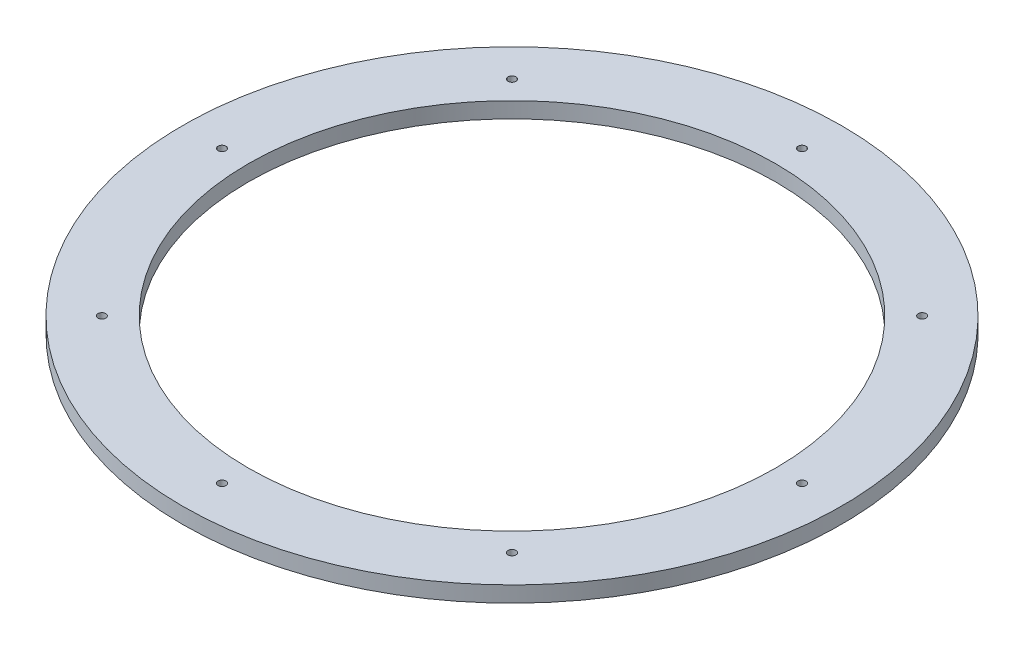
ISO-10303-21;
HEADER;
FILE_DESCRIPTION(('STEP AP214'),'2;1');
FILE_NAME('part.step','',(''),(''),'','','');
FILE_SCHEMA(('AUTOMOTIVE_DESIGN { 1 0 10303 214 1 1 1 1 }'));
ENDSEC;
DATA;
#1=APPLICATION_CONTEXT('core data for automotive mechanical design processes');
#2=APPLICATION_PROTOCOL_DEFINITION('international standard','automotive_design',2000,#1);
#3=PRODUCT_CONTEXT('',#1,'mechanical');
#4=PRODUCT('Part','Part','',(#3));
#5=PRODUCT_RELATED_PRODUCT_CATEGORY('part','',(#4));
#6=PRODUCT_DEFINITION_FORMATION('','',#4);
#7=PRODUCT_DEFINITION_CONTEXT('part definition',#1,'design');
#8=PRODUCT_DEFINITION('design','',#6,#7);
#9=PRODUCT_DEFINITION_SHAPE('','',#8);
#10=(LENGTH_UNIT() NAMED_UNIT(*) SI_UNIT(.MILLI.,.METRE.));
#11=(NAMED_UNIT(*) PLANE_ANGLE_UNIT() SI_UNIT($,.RADIAN.));
#12=(NAMED_UNIT(*) SI_UNIT($,.STERADIAN.) SOLID_ANGLE_UNIT());
#13=UNCERTAINTY_MEASURE_WITH_UNIT(LENGTH_MEASURE(1.E-05),#10,'distance_accuracy_value','');
#14=(GEOMETRIC_REPRESENTATION_CONTEXT(3) GLOBAL_UNCERTAINTY_ASSIGNED_CONTEXT((#13)) GLOBAL_UNIT_ASSIGNED_CONTEXT((#10,
#11,#12)) REPRESENTATION_CONTEXT('',''));
#15=CARTESIAN_POINT('',(0.,0.,0.));
#16=DIRECTION('',(0.,0.,1.));
#17=DIRECTION('',(1.,0.,0.));
#18=AXIS2_PLACEMENT_3D('',#15,#16,#17);
#19=CARTESIAN_POINT('',(0.,6.,0.));
#20=DIRECTION('',(0.,1.,0.));
#21=DIRECTION('',(0.,0.,1.));
#22=AXIS2_PLACEMENT_3D('',#19,#20,#21);
#23=PLANE('',#22);
#24=CARTESIAN_POINT('',(-110.,6.,0.));
#25=DIRECTION('',(0.,1.,0.));
#26=DIRECTION('',(0.,0.,-1.));
#27=AXIS2_PLACEMENT_3D('',#24,#25,#26);
#28=CIRCLE('',#27,1.5);
#29=CARTESIAN_POINT('',(-110.,6.,-1.5));
#30=VERTEX_POINT('',#29);
#31=EDGE_CURVE('E112',#30,#30,#28,.T.);
#32=ORIENTED_EDGE('',*,*,#31,.F.);
#33=EDGE_LOOP('',(#32));
#34=FACE_BOUND('',#33,.T.);
#35=CARTESIAN_POINT('',(0.,6.,-110.));
#36=DIRECTION('',(0.,1.,0.));
#37=DIRECTION('',(0.,0.,-1.));
#38=AXIS2_PLACEMENT_3D('',#35,#36,#37);
#39=CIRCLE('',#38,1.5);
#40=CARTESIAN_POINT('',(0.,6.,-111.5));
#41=VERTEX_POINT('',#40);
#42=EDGE_CURVE('E96',#41,#41,#39,.T.);
#43=ORIENTED_EDGE('',*,*,#42,.F.);
#44=EDGE_LOOP('',(#43));
#45=FACE_BOUND('',#44,.T.);
#46=CARTESIAN_POINT('',(110.,6.,0.));
#47=DIRECTION('',(0.,1.,0.));
#48=DIRECTION('',(0.,0.,1.));
#49=AXIS2_PLACEMENT_3D('',#46,#47,#48);
#50=CIRCLE('',#49,1.5);
#51=CARTESIAN_POINT('',(110.,6.,1.5));
#52=VERTEX_POINT('',#51);
#53=EDGE_CURVE('E80',#52,#52,#50,.T.);
#54=ORIENTED_EDGE('',*,*,#53,.F.);
#55=EDGE_LOOP('',(#54));
#56=FACE_BOUND('',#55,.T.);
#57=CARTESIAN_POINT('',(0.,6.,110.));
#58=DIRECTION('',(0.,1.,0.));
#59=DIRECTION('',(0.,0.,1.));
#60=AXIS2_PLACEMENT_3D('',#57,#58,#59);
#61=CIRCLE('',#60,1.5);
#62=CARTESIAN_POINT('',(0.,6.,111.5));
#63=VERTEX_POINT('',#62);
#64=EDGE_CURVE('E64',#63,#63,#61,.T.);
#65=ORIENTED_EDGE('',*,*,#64,.F.);
#66=EDGE_LOOP('',(#65));
#67=FACE_BOUND('',#66,.T.);
#68=CARTESIAN_POINT('',(0.,6.,0.));
#69=DIRECTION('',(0.,1.,0.));
#70=DIRECTION('',(0.,0.,1.));
#71=AXIS2_PLACEMENT_3D('',#68,#69,#70);
#72=CIRCLE('',#71,125.);
#73=CARTESIAN_POINT('',(0.,6.,125.));
#74=VERTEX_POINT('',#73);
#75=EDGE_CURVE('E10',#74,#74,#72,.T.);
#76=ORIENTED_EDGE('',*,*,#75,.T.);
#77=EDGE_LOOP('',(#76));
#78=FACE_BOUND('',#77,.T.);
#79=CARTESIAN_POINT('',(0.,6.,0.));
#80=DIRECTION('',(0.,1.,0.));
#81=DIRECTION('',(0.,0.,1.));
#82=AXIS2_PLACEMENT_3D('',#79,#80,#81);
#83=CIRCLE('',#82,100.);
#84=CARTESIAN_POINT('',(0.,6.,100.));
#85=VERTEX_POINT('',#84);
#86=EDGE_CURVE('E58',#85,#85,#83,.T.);
#87=ORIENTED_EDGE('',*,*,#86,.F.);
#88=EDGE_LOOP('',(#87));
#89=FACE_BOUND('',#88,.T.);
#90=CARTESIAN_POINT('',(77.7817459305202,6.,77.7817459305202));
#91=DIRECTION('',(0.,1.,0.));
#92=DIRECTION('',(0.,0.,1.));
#93=AXIS2_PLACEMENT_3D('',#90,#91,#92);
#94=CIRCLE('',#93,1.5);
#95=CARTESIAN_POINT('',(77.7817459305202,6.,79.2817459305202));
#96=VERTEX_POINT('',#95);
#97=EDGE_CURVE('E72',#96,#96,#94,.T.);
#98=ORIENTED_EDGE('',*,*,#97,.F.);
#99=EDGE_LOOP('',(#98));
#100=FACE_BOUND('',#99,.T.);
#101=CARTESIAN_POINT('',(77.7817459305202,6.,-77.7817459305202));
#102=DIRECTION('',(0.,1.,0.));
#103=DIRECTION('',(0.,0.,1.));
#104=AXIS2_PLACEMENT_3D('',#101,#102,#103);
#105=CIRCLE('',#104,1.5);
#106=CARTESIAN_POINT('',(77.7817459305202,6.,-76.2817459305202));
#107=VERTEX_POINT('',#106);
#108=EDGE_CURVE('E88',#107,#107,#105,.T.);
#109=ORIENTED_EDGE('',*,*,#108,.F.);
#110=EDGE_LOOP('',(#109));
#111=FACE_BOUND('',#110,.T.);
#112=CARTESIAN_POINT('',(-77.7817459305202,6.,-77.7817459305202));
#113=DIRECTION('',(0.,1.,0.));
#114=DIRECTION('',(0.,0.,-1.));
#115=AXIS2_PLACEMENT_3D('',#112,#113,#114);
#116=CIRCLE('',#115,1.49999999999996);
#117=CARTESIAN_POINT('',(-77.7817459305202,6.,-79.2817459305202));
#118=VERTEX_POINT('',#117);
#119=EDGE_CURVE('E104',#118,#118,#116,.T.);
#120=ORIENTED_EDGE('',*,*,#119,.F.);
#121=EDGE_LOOP('',(#120));
#122=FACE_BOUND('',#121,.T.);
#123=CARTESIAN_POINT('',(-77.7817459305203,6.,77.7817459305203));
#124=DIRECTION('',(0.,1.,0.));
#125=DIRECTION('',(0.,0.,-1.));
#126=AXIS2_PLACEMENT_3D('',#123,#124,#125);
#127=CIRCLE('',#126,1.49999999999994);
#128=CARTESIAN_POINT('',(-77.7817459305203,6.,76.2817459305203));
#129=VERTEX_POINT('',#128);
#130=EDGE_CURVE('E120',#129,#129,#127,.T.);
#131=ORIENTED_EDGE('',*,*,#130,.F.);
#132=EDGE_LOOP('',(#131));
#133=FACE_BOUND('',#132,.T.);
#134=ADVANCED_FACE('F45',(#34,#45,#56,#67,#78,#89,#100,#111,#122,#133),#23,.T.);
#135=CARTESIAN_POINT('',(0.,0.,0.));
#136=DIRECTION('',(0.,1.,0.));
#137=DIRECTION('',(0.,0.,1.));
#138=AXIS2_PLACEMENT_3D('',#135,#136,#137);
#139=PLANE('',#138);
#140=CARTESIAN_POINT('',(0.,0.,0.));
#141=DIRECTION('',(0.,1.,0.));
#142=DIRECTION('',(0.,0.,1.));
#143=AXIS2_PLACEMENT_3D('',#140,#141,#142);
#144=CIRCLE('',#143,125.);
#145=CARTESIAN_POINT('',(0.,0.,125.));
#146=VERTEX_POINT('',#145);
#147=EDGE_CURVE('E49',#146,#146,#144,.T.);
#148=ORIENTED_EDGE('',*,*,#147,.F.);
#149=EDGE_LOOP('',(#148));
#150=FACE_BOUND('',#149,.T.);
#151=CARTESIAN_POINT('',(0.,0.,0.));
#152=DIRECTION('',(0.,1.,0.));
#153=DIRECTION('',(0.,0.,1.));
#154=AXIS2_PLACEMENT_3D('',#151,#152,#153);
#155=CIRCLE('',#154,100.);
#156=CARTESIAN_POINT('',(0.,0.,100.));
#157=VERTEX_POINT('',#156);
#158=EDGE_CURVE('E60',#157,#157,#155,.T.);
#159=ORIENTED_EDGE('',*,*,#158,.T.);
#160=EDGE_LOOP('',(#159));
#161=FACE_BOUND('',#160,.T.);
#162=CARTESIAN_POINT('',(0.,0.,110.));
#163=DIRECTION('',(0.,1.,0.));
#164=DIRECTION('',(0.,0.,1.));
#165=AXIS2_PLACEMENT_3D('',#162,#163,#164);
#166=CIRCLE('',#165,1.5);
#167=CARTESIAN_POINT('',(0.,0.,111.5));
#168=VERTEX_POINT('',#167);
#169=EDGE_CURVE('E68',#168,#168,#166,.T.);
#170=ORIENTED_EDGE('',*,*,#169,.T.);
#171=EDGE_LOOP('',(#170));
#172=FACE_BOUND('',#171,.T.);
#173=CARTESIAN_POINT('',(77.7817459305202,0.,77.7817459305202));
#174=DIRECTION('',(0.,1.,0.));
#175=DIRECTION('',(0.,0.,1.));
#176=AXIS2_PLACEMENT_3D('',#173,#174,#175);
#177=CIRCLE('',#176,1.5);
#178=CARTESIAN_POINT('',(77.7817459305202,0.,79.2817459305202));
#179=VERTEX_POINT('',#178);
#180=EDGE_CURVE('E76',#179,#179,#177,.T.);
#181=ORIENTED_EDGE('',*,*,#180,.T.);
#182=EDGE_LOOP('',(#181));
#183=FACE_BOUND('',#182,.T.);
#184=CARTESIAN_POINT('',(110.,0.,0.));
#185=DIRECTION('',(0.,1.,0.));
#186=DIRECTION('',(0.,0.,1.));
#187=AXIS2_PLACEMENT_3D('',#184,#185,#186);
#188=CIRCLE('',#187,1.5);
#189=CARTESIAN_POINT('',(110.,0.,1.5));
#190=VERTEX_POINT('',#189);
#191=EDGE_CURVE('E84',#190,#190,#188,.T.);
#192=ORIENTED_EDGE('',*,*,#191,.T.);
#193=EDGE_LOOP('',(#192));
#194=FACE_BOUND('',#193,.T.);
#195=CARTESIAN_POINT('',(77.7817459305202,0.,-77.7817459305202));
#196=DIRECTION('',(0.,1.,0.));
#197=DIRECTION('',(0.,0.,1.));
#198=AXIS2_PLACEMENT_3D('',#195,#196,#197);
#199=CIRCLE('',#198,1.5);
#200=CARTESIAN_POINT('',(77.7817459305202,0.,-76.2817459305202));
#201=VERTEX_POINT('',#200);
#202=EDGE_CURVE('E92',#201,#201,#199,.T.);
#203=ORIENTED_EDGE('',*,*,#202,.T.);
#204=EDGE_LOOP('',(#203));
#205=FACE_BOUND('',#204,.T.);
#206=CARTESIAN_POINT('',(0.,0.,-110.));
#207=DIRECTION('',(0.,1.,0.));
#208=DIRECTION('',(0.,0.,-1.));
#209=AXIS2_PLACEMENT_3D('',#206,#207,#208);
#210=CIRCLE('',#209,1.5);
#211=CARTESIAN_POINT('',(0.,0.,-111.5));
#212=VERTEX_POINT('',#211);
#213=EDGE_CURVE('E100',#212,#212,#210,.T.);
#214=ORIENTED_EDGE('',*,*,#213,.T.);
#215=EDGE_LOOP('',(#214));
#216=FACE_BOUND('',#215,.T.);
#217=CARTESIAN_POINT('',(-77.7817459305202,0.,-77.7817459305202));
#218=DIRECTION('',(0.,1.,0.));
#219=DIRECTION('',(0.,0.,-1.));
#220=AXIS2_PLACEMENT_3D('',#217,#218,#219);
#221=CIRCLE('',#220,1.49999999999996);
#222=CARTESIAN_POINT('',(-77.7817459305202,0.,-79.2817459305202));
#223=VERTEX_POINT('',#222);
#224=EDGE_CURVE('E108',#223,#223,#221,.T.);
#225=ORIENTED_EDGE('',*,*,#224,.T.);
#226=EDGE_LOOP('',(#225));
#227=FACE_BOUND('',#226,.T.);
#228=CARTESIAN_POINT('',(-110.,0.,0.));
#229=DIRECTION('',(0.,1.,0.));
#230=DIRECTION('',(0.,0.,-1.));
#231=AXIS2_PLACEMENT_3D('',#228,#229,#230);
#232=CIRCLE('',#231,1.5);
#233=CARTESIAN_POINT('',(-110.,0.,-1.5));
#234=VERTEX_POINT('',#233);
#235=EDGE_CURVE('E116',#234,#234,#232,.T.);
#236=ORIENTED_EDGE('',*,*,#235,.T.);
#237=EDGE_LOOP('',(#236));
#238=FACE_BOUND('',#237,.T.);
#239=CARTESIAN_POINT('',(-77.7817459305203,0.,77.7817459305203));
#240=DIRECTION('',(0.,1.,0.));
#241=DIRECTION('',(0.,0.,-1.));
#242=AXIS2_PLACEMENT_3D('',#239,#240,#241);
#243=CIRCLE('',#242,1.49999999999994);
#244=CARTESIAN_POINT('',(-77.7817459305203,0.,76.2817459305203));
#245=VERTEX_POINT('',#244);
#246=EDGE_CURVE('E124',#245,#245,#243,.T.);
#247=ORIENTED_EDGE('',*,*,#246,.T.);
#248=EDGE_LOOP('',(#247));
#249=FACE_BOUND('',#248,.T.);
#250=ADVANCED_FACE('F136',(#150,#161,#172,#183,#194,#205,#216,#227,#238,#249),#139,.F.);
#251=CARTESIAN_POINT('',(0.,6.,0.));
#252=DIRECTION('',(0.,-1.,0.));
#253=DIRECTION('',(0.,0.,-1.));
#254=AXIS2_PLACEMENT_3D('',#251,#252,#253);
#255=CYLINDRICAL_SURFACE('',#254,125.);
#256=ORIENTED_EDGE('',*,*,#75,.F.);
#257=EDGE_LOOP('',(#256));
#258=FACE_BOUND('',#257,.T.);
#259=ORIENTED_EDGE('',*,*,#147,.T.);
#260=EDGE_LOOP('',(#259));
#261=FACE_BOUND('',#260,.T.);
#262=ADVANCED_FACE('F47',(#258,#261),#255,.T.);
#263=CARTESIAN_POINT('',(0.,6.,0.));
#264=DIRECTION('',(0.,-1.,0.));
#265=DIRECTION('',(0.,0.,-1.));
#266=AXIS2_PLACEMENT_3D('',#263,#264,#265);
#267=CYLINDRICAL_SURFACE('',#266,100.);
#268=ORIENTED_EDGE('',*,*,#86,.T.);
#269=EDGE_LOOP('',(#268));
#270=FACE_BOUND('',#269,.T.);
#271=ORIENTED_EDGE('',*,*,#158,.F.);
#272=EDGE_LOOP('',(#271));
#273=FACE_BOUND('',#272,.T.);
#274=ADVANCED_FACE('F146',(#270,#273),#267,.F.);
#275=CARTESIAN_POINT('',(0.,6.,110.));
#276=DIRECTION('',(0.,-1.,0.));
#277=DIRECTION('',(0.,0.,-1.));
#278=AXIS2_PLACEMENT_3D('',#275,#276,#277);
#279=CYLINDRICAL_SURFACE('',#278,1.5);
#280=ORIENTED_EDGE('',*,*,#64,.T.);
#281=EDGE_LOOP('',(#280));
#282=FACE_BOUND('',#281,.T.);
#283=ORIENTED_EDGE('',*,*,#169,.F.);
#284=EDGE_LOOP('',(#283));
#285=FACE_BOUND('',#284,.T.);
#286=ADVANCED_FACE('F149',(#282,#285),#279,.F.);
#287=CARTESIAN_POINT('',(77.7817459305202,6.,77.7817459305202));
#288=DIRECTION('',(0.,-1.,0.));
#289=DIRECTION('',(0.,0.,-1.));
#290=AXIS2_PLACEMENT_3D('',#287,#288,#289);
#291=CYLINDRICAL_SURFACE('',#290,1.5);
#292=ORIENTED_EDGE('',*,*,#97,.T.);
#293=EDGE_LOOP('',(#292));
#294=FACE_BOUND('',#293,.T.);
#295=ORIENTED_EDGE('',*,*,#180,.F.);
#296=EDGE_LOOP('',(#295));
#297=FACE_BOUND('',#296,.T.);
#298=ADVANCED_FACE('F153',(#294,#297),#291,.F.);
#299=CARTESIAN_POINT('',(110.,6.,0.));
#300=DIRECTION('',(0.,-1.,0.));
#301=DIRECTION('',(0.,0.,-1.));
#302=AXIS2_PLACEMENT_3D('',#299,#300,#301);
#303=CYLINDRICAL_SURFACE('',#302,1.5);
#304=ORIENTED_EDGE('',*,*,#53,.T.);
#305=EDGE_LOOP('',(#304));
#306=FACE_BOUND('',#305,.T.);
#307=ORIENTED_EDGE('',*,*,#191,.F.);
#308=EDGE_LOOP('',(#307));
#309=FACE_BOUND('',#308,.T.);
#310=ADVANCED_FACE('F157',(#306,#309),#303,.F.);
#311=CARTESIAN_POINT('',(77.7817459305202,6.,-77.7817459305202));
#312=DIRECTION('',(0.,-1.,0.));
#313=DIRECTION('',(0.,0.,-1.));
#314=AXIS2_PLACEMENT_3D('',#311,#312,#313);
#315=CYLINDRICAL_SURFACE('',#314,1.5);
#316=ORIENTED_EDGE('',*,*,#108,.T.);
#317=EDGE_LOOP('',(#316));
#318=FACE_BOUND('',#317,.T.);
#319=ORIENTED_EDGE('',*,*,#202,.F.);
#320=EDGE_LOOP('',(#319));
#321=FACE_BOUND('',#320,.T.);
#322=ADVANCED_FACE('F161',(#318,#321),#315,.F.);
#323=CARTESIAN_POINT('',(0.,6.,-110.));
#324=DIRECTION('',(0.,-1.,0.));
#325=DIRECTION('',(0.,0.,-1.));
#326=AXIS2_PLACEMENT_3D('',#323,#324,#325);
#327=CYLINDRICAL_SURFACE('',#326,1.5);
#328=ORIENTED_EDGE('',*,*,#42,.T.);
#329=EDGE_LOOP('',(#328));
#330=FACE_BOUND('',#329,.T.);
#331=ORIENTED_EDGE('',*,*,#213,.F.);
#332=EDGE_LOOP('',(#331));
#333=FACE_BOUND('',#332,.T.);
#334=ADVANCED_FACE('F165',(#330,#333),#327,.F.);
#335=CARTESIAN_POINT('',(-77.7817459305202,6.,-77.7817459305202));
#336=DIRECTION('',(0.,-1.,0.));
#337=DIRECTION('',(0.,0.,-1.));
#338=AXIS2_PLACEMENT_3D('',#335,#336,#337);
#339=CYLINDRICAL_SURFACE('',#338,1.49999999999996);
#340=ORIENTED_EDGE('',*,*,#119,.T.);
#341=EDGE_LOOP('',(#340));
#342=FACE_BOUND('',#341,.T.);
#343=ORIENTED_EDGE('',*,*,#224,.F.);
#344=EDGE_LOOP('',(#343));
#345=FACE_BOUND('',#344,.T.);
#346=ADVANCED_FACE('F169',(#342,#345),#339,.F.);
#347=CARTESIAN_POINT('',(-110.,6.,0.));
#348=DIRECTION('',(0.,-1.,0.));
#349=DIRECTION('',(0.,0.,-1.));
#350=AXIS2_PLACEMENT_3D('',#347,#348,#349);
#351=CYLINDRICAL_SURFACE('',#350,1.5);
#352=ORIENTED_EDGE('',*,*,#31,.T.);
#353=EDGE_LOOP('',(#352));
#354=FACE_BOUND('',#353,.T.);
#355=ORIENTED_EDGE('',*,*,#235,.F.);
#356=EDGE_LOOP('',(#355));
#357=FACE_BOUND('',#356,.T.);
#358=ADVANCED_FACE('F173',(#354,#357),#351,.F.);
#359=CARTESIAN_POINT('',(-77.7817459305203,6.,77.7817459305203));
#360=DIRECTION('',(0.,-1.,0.));
#361=DIRECTION('',(0.,0.,-1.));
#362=AXIS2_PLACEMENT_3D('',#359,#360,#361);
#363=CYLINDRICAL_SURFACE('',#362,1.49999999999994);
#364=ORIENTED_EDGE('',*,*,#130,.T.);
#365=EDGE_LOOP('',(#364));
#366=FACE_BOUND('',#365,.T.);
#367=ORIENTED_EDGE('',*,*,#246,.F.);
#368=EDGE_LOOP('',(#367));
#369=FACE_BOUND('',#368,.T.);
#370=ADVANCED_FACE('F132',(#366,#369),#363,.F.);
#371=CLOSED_SHELL('',(#134,#250,#262,#274,#286,#298,#310,#322,#334,#346,#358,#370));
#372=MANIFOLD_SOLID_BREP('B2',#371);
#373=ADVANCED_BREP_SHAPE_REPRESENTATION('',(#18,#372),#14);
#374=SHAPE_DEFINITION_REPRESENTATION(#9,#373);
ENDSEC;
END-ISO-10303-21;
